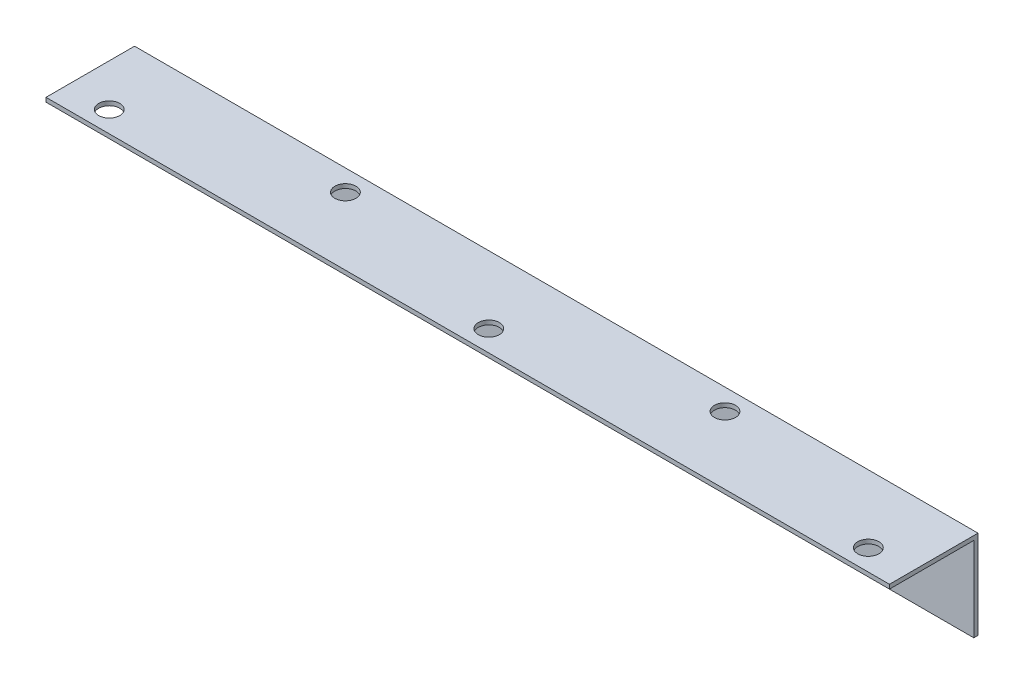
ISO-10303-21;
HEADER;
FILE_DESCRIPTION(('STEP AP214'),'2;1');
FILE_NAME('part.step','',(''),(''),'','','');
FILE_SCHEMA(('AUTOMOTIVE_DESIGN { 1 0 10303 214 1 1 1 1 }'));
ENDSEC;
DATA;
#1=APPLICATION_CONTEXT('core data for automotive mechanical design processes');
#2=APPLICATION_PROTOCOL_DEFINITION('international standard','automotive_design',2000,#1);
#3=PRODUCT_CONTEXT('',#1,'mechanical');
#4=PRODUCT('Part','Part','',(#3));
#5=PRODUCT_RELATED_PRODUCT_CATEGORY('part','',(#4));
#6=PRODUCT_DEFINITION_FORMATION('','',#4);
#7=PRODUCT_DEFINITION_CONTEXT('part definition',#1,'design');
#8=PRODUCT_DEFINITION('design','',#6,#7);
#9=PRODUCT_DEFINITION_SHAPE('','',#8);
#10=(LENGTH_UNIT() NAMED_UNIT(*) SI_UNIT(.MILLI.,.METRE.));
#11=(NAMED_UNIT(*) PLANE_ANGLE_UNIT() SI_UNIT($,.RADIAN.));
#12=(NAMED_UNIT(*) SI_UNIT($,.STERADIAN.) SOLID_ANGLE_UNIT());
#13=UNCERTAINTY_MEASURE_WITH_UNIT(LENGTH_MEASURE(1.E-05),#10,'distance_accuracy_value','');
#14=(GEOMETRIC_REPRESENTATION_CONTEXT(3) GLOBAL_UNCERTAINTY_ASSIGNED_CONTEXT((#13)) GLOBAL_UNIT_ASSIGNED_CONTEXT((#10,
#11,#12)) REPRESENTATION_CONTEXT('',''));
#15=CARTESIAN_POINT('',(0.,0.,0.));
#16=DIRECTION('',(0.,0.,1.));
#17=DIRECTION('',(1.,0.,0.));
#18=AXIS2_PLACEMENT_3D('',#15,#16,#17);
#19=CARTESIAN_POINT('',(0.,0.,1.));
#20=DIRECTION('',(-1.,0.,0.));
#21=DIRECTION('',(0.,0.,1.));
#22=AXIS2_PLACEMENT_3D('',#19,#20,#21);
#23=PLANE('',#22);
#24=DIRECTION('',(0.,1.,0.));
#25=VECTOR('',#24,1.);
#26=CARTESIAN_POINT('',(0.,0.,0.));
#27=LINE('',#26,#25);
#28=CARTESIAN_POINT('',(0.,0.,0.));
#29=VERTEX_POINT('',#28);
#30=CARTESIAN_POINT('',(0.,21.,0.));
#31=VERTEX_POINT('',#30);
#32=EDGE_CURVE('E116',#29,#31,#27,.T.);
#33=ORIENTED_EDGE('',*,*,#32,.T.);
#34=DIRECTION('',(0.,0.,-1.));
#35=VECTOR('',#34,1.);
#36=CARTESIAN_POINT('',(0.,21.,0.));
#37=LINE('',#36,#35);
#38=CARTESIAN_POINT('',(0.,21.,21.));
#39=VERTEX_POINT('',#38);
#40=EDGE_CURVE('E194',#39,#31,#37,.T.);
#41=ORIENTED_EDGE('',*,*,#40,.F.);
#42=DIRECTION('',(0.,-1.,0.));
#43=VECTOR('',#42,1.);
#44=CARTESIAN_POINT('',(0.,21.,21.));
#45=LINE('',#44,#43);
#46=CARTESIAN_POINT('',(0.,20.,21.));
#47=VERTEX_POINT('',#46);
#48=EDGE_CURVE('E201',#39,#47,#45,.T.);
#49=ORIENTED_EDGE('',*,*,#48,.T.);
#50=DIRECTION('',(0.,0.,-1.));
#51=VECTOR('',#50,1.);
#52=CARTESIAN_POINT('',(0.,20.,0.));
#53=LINE('',#52,#51);
#54=CARTESIAN_POINT('',(0.,20.,1.));
#55=VERTEX_POINT('',#54);
#56=EDGE_CURVE('E190',#47,#55,#53,.T.);
#57=ORIENTED_EDGE('',*,*,#56,.T.);
#58=DIRECTION('',(0.,1.,0.));
#59=VECTOR('',#58,1.);
#60=CARTESIAN_POINT('',(0.,0.,1.));
#61=LINE('',#60,#59);
#62=CARTESIAN_POINT('',(0.,0.,1.));
#63=VERTEX_POINT('',#62);
#64=EDGE_CURVE('E106',#63,#55,#61,.T.);
#65=ORIENTED_EDGE('',*,*,#64,.F.);
#66=DIRECTION('',(0.,0.,-1.));
#67=VECTOR('',#66,1.);
#68=CARTESIAN_POINT('',(0.,0.,1.));
#69=LINE('',#68,#67);
#70=EDGE_CURVE('E52',#63,#29,#69,.T.);
#71=ORIENTED_EDGE('',*,*,#70,.T.);
#72=EDGE_LOOP('',(#33,#41,#49,#57,#65,#71));
#73=FACE_BOUND('',#72,.T.);
#74=ADVANCED_FACE('F42',(#73),#23,.F.);
#75=CARTESIAN_POINT('',(-200.,0.,1.));
#76=DIRECTION('',(1.,0.,0.));
#77=DIRECTION('',(0.,0.,-1.));
#78=AXIS2_PLACEMENT_3D('',#75,#76,#77);
#79=PLANE('',#78);
#80=DIRECTION('',(0.,-1.,0.));
#81=VECTOR('',#80,1.);
#82=CARTESIAN_POINT('',(-200.,0.,0.));
#83=LINE('',#82,#81);
#84=CARTESIAN_POINT('',(-200.,21.,0.));
#85=VERTEX_POINT('',#84);
#86=CARTESIAN_POINT('',(-200.,0.,0.));
#87=VERTEX_POINT('',#86);
#88=EDGE_CURVE('E73',#85,#87,#83,.T.);
#89=ORIENTED_EDGE('',*,*,#88,.T.);
#90=DIRECTION('',(0.,0.,-1.));
#91=VECTOR('',#90,1.);
#92=CARTESIAN_POINT('',(-200.,0.,1.));
#93=LINE('',#92,#91);
#94=CARTESIAN_POINT('',(-200.,0.,1.));
#95=VERTEX_POINT('',#94);
#96=EDGE_CURVE('E11',#95,#87,#93,.T.);
#97=ORIENTED_EDGE('',*,*,#96,.F.);
#98=DIRECTION('',(0.,-1.,0.));
#99=VECTOR('',#98,1.);
#100=CARTESIAN_POINT('',(-200.,0.,1.));
#101=LINE('',#100,#99);
#102=CARTESIAN_POINT('',(-200.,20.,1.));
#103=VERTEX_POINT('',#102);
#104=EDGE_CURVE('E104',#103,#95,#101,.T.);
#105=ORIENTED_EDGE('',*,*,#104,.F.);
#106=DIRECTION('',(0.,0.,1.));
#107=VECTOR('',#106,1.);
#108=CARTESIAN_POINT('',(-200.,20.,0.));
#109=LINE('',#108,#107);
#110=CARTESIAN_POINT('',(-200.,20.,21.));
#111=VERTEX_POINT('',#110);
#112=EDGE_CURVE('E91',#103,#111,#109,.T.);
#113=ORIENTED_EDGE('',*,*,#112,.T.);
#114=DIRECTION('',(0.,-1.,0.));
#115=VECTOR('',#114,1.);
#116=CARTESIAN_POINT('',(-200.,21.,21.));
#117=LINE('',#116,#115);
#118=CARTESIAN_POINT('',(-200.,21.,21.));
#119=VERTEX_POINT('',#118);
#120=EDGE_CURVE('E120',#119,#111,#117,.T.);
#121=ORIENTED_EDGE('',*,*,#120,.F.);
#122=DIRECTION('',(0.,0.,1.));
#123=VECTOR('',#122,1.);
#124=CARTESIAN_POINT('',(-200.,21.,0.));
#125=LINE('',#124,#123);
#126=EDGE_CURVE('E185',#85,#119,#125,.T.);
#127=ORIENTED_EDGE('',*,*,#126,.F.);
#128=EDGE_LOOP('',(#89,#97,#105,#113,#121,#127));
#129=FACE_BOUND('',#128,.T.);
#130=ADVANCED_FACE('F109',(#129),#79,.F.);
#131=CARTESIAN_POINT('',(0.,0.,1.));
#132=DIRECTION('',(0.,1.,0.));
#133=DIRECTION('',(0.,0.,1.));
#134=AXIS2_PLACEMENT_3D('',#131,#132,#133);
#135=PLANE('',#134);
#136=DIRECTION('',(1.,0.,0.));
#137=VECTOR('',#136,1.);
#138=CARTESIAN_POINT('',(0.,0.,0.));
#139=LINE('',#138,#137);
#140=EDGE_CURVE('E123',#87,#29,#139,.T.);
#141=ORIENTED_EDGE('',*,*,#140,.T.);
#142=ORIENTED_EDGE('',*,*,#70,.F.);
#143=DIRECTION('',(1.,0.,0.));
#144=VECTOR('',#143,1.);
#145=CARTESIAN_POINT('',(0.,0.,1.));
#146=LINE('',#145,#144);
#147=EDGE_CURVE('E61',#95,#63,#146,.T.);
#148=ORIENTED_EDGE('',*,*,#147,.F.);
#149=ORIENTED_EDGE('',*,*,#96,.T.);
#150=EDGE_LOOP('',(#141,#142,#148,#149));
#151=FACE_BOUND('',#150,.T.);
#152=ADVANCED_FACE('F232',(#151),#135,.F.);
#153=CARTESIAN_POINT('',(0.,0.,1.));
#154=DIRECTION('',(0.,0.,1.));
#155=DIRECTION('',(1.,0.,0.));
#156=AXIS2_PLACEMENT_3D('',#153,#154,#155);
#157=PLANE('',#156);
#158=CARTESIAN_POINT('',(-140.,9.37245522552197,1.));
#159=DIRECTION('',(0.,0.,1.));
#160=DIRECTION('',(1.,0.,0.));
#161=AXIS2_PLACEMENT_3D('',#158,#159,#160);
#162=CIRCLE('',#161,3.99999999999999);
#163=CARTESIAN_POINT('',(-136.,9.37245522552197,1.));
#164=VERTEX_POINT('',#163);
#165=EDGE_CURVE('E131',#164,#164,#162,.T.);
#166=ORIENTED_EDGE('',*,*,#165,.F.);
#167=EDGE_LOOP('',(#166));
#168=FACE_BOUND('',#167,.T.);
#169=CARTESIAN_POINT('',(-60.,9.37245522552199,1.));
#170=DIRECTION('',(0.,0.,1.));
#171=DIRECTION('',(1.,0.,0.));
#172=AXIS2_PLACEMENT_3D('',#169,#170,#171);
#173=CIRCLE('',#172,4.00000000000001);
#174=CARTESIAN_POINT('',(-56.,9.37245522552199,1.));
#175=VERTEX_POINT('',#174);
#176=EDGE_CURVE('E139',#175,#175,#173,.T.);
#177=ORIENTED_EDGE('',*,*,#176,.F.);
#178=EDGE_LOOP('',(#177));
#179=FACE_BOUND('',#178,.T.);
#180=ORIENTED_EDGE('',*,*,#64,.T.);
#181=DIRECTION('',(-1.,0.,0.));
#182=VECTOR('',#181,1.);
#183=CARTESIAN_POINT('',(0.,20.,1.));
#184=LINE('',#183,#182);
#185=EDGE_CURVE('E82',#55,#103,#184,.T.);
#186=ORIENTED_EDGE('',*,*,#185,.T.);
#187=ORIENTED_EDGE('',*,*,#104,.T.);
#188=ORIENTED_EDGE('',*,*,#147,.T.);
#189=EDGE_LOOP('',(#180,#186,#187,#188));
#190=FACE_BOUND('',#189,.T.);
#191=ADVANCED_FACE('F103',(#168,#179,#190),#157,.T.);
#192=CARTESIAN_POINT('',(0.,0.,0.));
#193=DIRECTION('',(0.,0.,1.));
#194=DIRECTION('',(1.,0.,0.));
#195=AXIS2_PLACEMENT_3D('',#192,#193,#194);
#196=PLANE('',#195);
#197=CARTESIAN_POINT('',(-140.,9.37245522552197,0.));
#198=DIRECTION('',(0.,0.,1.));
#199=DIRECTION('',(1.,0.,0.));
#200=AXIS2_PLACEMENT_3D('',#197,#198,#199);
#201=CIRCLE('',#200,3.99999999999999);
#202=CARTESIAN_POINT('',(-136.,9.37245522552197,0.));
#203=VERTEX_POINT('',#202);
#204=EDGE_CURVE('E45',#203,#203,#201,.T.);
#205=ORIENTED_EDGE('',*,*,#204,.T.);
#206=EDGE_LOOP('',(#205));
#207=FACE_BOUND('',#206,.T.);
#208=CARTESIAN_POINT('',(-60.,9.37245522552199,0.));
#209=DIRECTION('',(0.,0.,1.));
#210=DIRECTION('',(1.,0.,0.));
#211=AXIS2_PLACEMENT_3D('',#208,#209,#210);
#212=CIRCLE('',#211,4.00000000000001);
#213=CARTESIAN_POINT('',(-56.,9.37245522552199,0.));
#214=VERTEX_POINT('',#213);
#215=EDGE_CURVE('E128',#214,#214,#212,.T.);
#216=ORIENTED_EDGE('',*,*,#215,.T.);
#217=EDGE_LOOP('',(#216));
#218=FACE_BOUND('',#217,.T.);
#219=ORIENTED_EDGE('',*,*,#32,.F.);
#220=ORIENTED_EDGE('',*,*,#140,.F.);
#221=ORIENTED_EDGE('',*,*,#88,.F.);
#222=DIRECTION('',(-1.,0.,0.));
#223=VECTOR('',#222,1.);
#224=CARTESIAN_POINT('',(-200.,21.,0.));
#225=LINE('',#224,#223);
#226=EDGE_CURVE('E198',#31,#85,#225,.T.);
#227=ORIENTED_EDGE('',*,*,#226,.F.);
#228=EDGE_LOOP('',(#219,#220,#221,#227));
#229=FACE_BOUND('',#228,.T.);
#230=ADVANCED_FACE('F230',(#207,#218,#229),#196,.F.);
#231=CARTESIAN_POINT('',(0.,21.,0.));
#232=DIRECTION('',(0.,1.,0.));
#233=DIRECTION('',(0.,0.,1.));
#234=AXIS2_PLACEMENT_3D('',#231,#232,#233);
#235=PLANE('',#234);
#236=CARTESIAN_POINT('',(-55.,21.,5.));
#237=DIRECTION('',(0.,1.,0.));
#238=DIRECTION('',(0.,0.,1.));
#239=AXIS2_PLACEMENT_3D('',#236,#237,#238);
#240=CIRCLE('',#239,2.5);
#241=CARTESIAN_POINT('',(-55.,21.,7.5));
#242=VERTEX_POINT('',#241);
#243=EDGE_CURVE('E155',#242,#242,#240,.T.);
#244=ORIENTED_EDGE('',*,*,#243,.F.);
#245=EDGE_LOOP('',(#244));
#246=FACE_BOUND('',#245,.T.);
#247=CARTESIAN_POINT('',(-145.,21.,5.));
#248=DIRECTION('',(0.,1.,0.));
#249=DIRECTION('',(0.,0.,1.));
#250=AXIS2_PLACEMENT_3D('',#247,#248,#249);
#251=CIRCLE('',#250,2.5);
#252=CARTESIAN_POINT('',(-145.,21.,7.5));
#253=VERTEX_POINT('',#252);
#254=EDGE_CURVE('E171',#253,#253,#251,.T.);
#255=ORIENTED_EDGE('',*,*,#254,.F.);
#256=EDGE_LOOP('',(#255));
#257=FACE_BOUND('',#256,.T.);
#258=ORIENTED_EDGE('',*,*,#126,.T.);
#259=DIRECTION('',(1.,0.,0.));
#260=VECTOR('',#259,1.);
#261=CARTESIAN_POINT('',(-200.,21.,21.));
#262=LINE('',#261,#260);
#263=EDGE_CURVE('E189',#119,#39,#262,.T.);
#264=ORIENTED_EDGE('',*,*,#263,.T.);
#265=ORIENTED_EDGE('',*,*,#40,.T.);
#266=ORIENTED_EDGE('',*,*,#226,.T.);
#267=EDGE_LOOP('',(#258,#264,#265,#266));
#268=FACE_BOUND('',#267,.T.);
#269=CARTESIAN_POINT('',(-190.,21.,16.));
#270=DIRECTION('',(0.,1.,0.));
#271=DIRECTION('',(0.,0.,1.));
#272=AXIS2_PLACEMENT_3D('',#269,#270,#271);
#273=CIRCLE('',#272,2.5);
#274=CARTESIAN_POINT('',(-190.,21.,18.5));
#275=VERTEX_POINT('',#274);
#276=EDGE_CURVE('E101',#275,#275,#273,.T.);
#277=ORIENTED_EDGE('',*,*,#276,.F.);
#278=EDGE_LOOP('',(#277));
#279=FACE_BOUND('',#278,.T.);
#280=CARTESIAN_POINT('',(-100.,21.,16.));
#281=DIRECTION('',(0.,1.,0.));
#282=DIRECTION('',(0.,0.,1.));
#283=AXIS2_PLACEMENT_3D('',#280,#281,#282);
#284=CIRCLE('',#283,2.49999999999999);
#285=CARTESIAN_POINT('',(-100.,21.,18.5));
#286=VERTEX_POINT('',#285);
#287=EDGE_CURVE('E163',#286,#286,#284,.T.);
#288=ORIENTED_EDGE('',*,*,#287,.F.);
#289=EDGE_LOOP('',(#288));
#290=FACE_BOUND('',#289,.T.);
#291=CARTESIAN_POINT('',(-10.,21.,16.));
#292=DIRECTION('',(0.,1.,0.));
#293=DIRECTION('',(0.,0.,1.));
#294=AXIS2_PLACEMENT_3D('',#291,#292,#293);
#295=CIRCLE('',#294,2.5);
#296=CARTESIAN_POINT('',(-10.,21.,18.5));
#297=VERTEX_POINT('',#296);
#298=EDGE_CURVE('E147',#297,#297,#295,.T.);
#299=ORIENTED_EDGE('',*,*,#298,.F.);
#300=EDGE_LOOP('',(#299));
#301=FACE_BOUND('',#300,.T.);
#302=ADVANCED_FACE('F228',(#246,#257,#268,#279,#290,#301),#235,.T.);
#303=CARTESIAN_POINT('',(0.,20.,0.));
#304=DIRECTION('',(0.,1.,0.));
#305=DIRECTION('',(0.,0.,1.));
#306=AXIS2_PLACEMENT_3D('',#303,#304,#305);
#307=PLANE('',#306);
#308=ORIENTED_EDGE('',*,*,#185,.F.);
#309=ORIENTED_EDGE('',*,*,#56,.F.);
#310=DIRECTION('',(1.,0.,0.));
#311=VECTOR('',#310,1.);
#312=CARTESIAN_POINT('',(-200.,20.,21.));
#313=LINE('',#312,#311);
#314=EDGE_CURVE('E96',#111,#47,#313,.T.);
#315=ORIENTED_EDGE('',*,*,#314,.F.);
#316=ORIENTED_EDGE('',*,*,#112,.F.);
#317=EDGE_LOOP('',(#308,#309,#315,#316));
#318=FACE_BOUND('',#317,.T.);
#319=CARTESIAN_POINT('',(-190.,20.,16.));
#320=DIRECTION('',(0.,1.,0.));
#321=DIRECTION('',(0.,0.,1.));
#322=AXIS2_PLACEMENT_3D('',#319,#320,#321);
#323=CIRCLE('',#322,2.5);
#324=CARTESIAN_POINT('',(-190.,20.,18.5));
#325=VERTEX_POINT('',#324);
#326=EDGE_CURVE('E175',#325,#325,#323,.T.);
#327=ORIENTED_EDGE('',*,*,#326,.T.);
#328=EDGE_LOOP('',(#327));
#329=FACE_BOUND('',#328,.T.);
#330=CARTESIAN_POINT('',(-145.,20.,5.));
#331=DIRECTION('',(0.,1.,0.));
#332=DIRECTION('',(0.,0.,1.));
#333=AXIS2_PLACEMENT_3D('',#330,#331,#332);
#334=CIRCLE('',#333,2.5);
#335=CARTESIAN_POINT('',(-145.,20.,7.5));
#336=VERTEX_POINT('',#335);
#337=EDGE_CURVE('E167',#336,#336,#334,.T.);
#338=ORIENTED_EDGE('',*,*,#337,.T.);
#339=EDGE_LOOP('',(#338));
#340=FACE_BOUND('',#339,.T.);
#341=CARTESIAN_POINT('',(-100.,20.,16.));
#342=DIRECTION('',(0.,1.,0.));
#343=DIRECTION('',(0.,0.,1.));
#344=AXIS2_PLACEMENT_3D('',#341,#342,#343);
#345=CIRCLE('',#344,2.49999999999999);
#346=CARTESIAN_POINT('',(-100.,20.,18.5));
#347=VERTEX_POINT('',#346);
#348=EDGE_CURVE('E159',#347,#347,#345,.T.);
#349=ORIENTED_EDGE('',*,*,#348,.T.);
#350=EDGE_LOOP('',(#349));
#351=FACE_BOUND('',#350,.T.);
#352=CARTESIAN_POINT('',(-55.,20.,5.));
#353=DIRECTION('',(0.,1.,0.));
#354=DIRECTION('',(0.,0.,1.));
#355=AXIS2_PLACEMENT_3D('',#352,#353,#354);
#356=CIRCLE('',#355,2.5);
#357=CARTESIAN_POINT('',(-55.,20.,7.5));
#358=VERTEX_POINT('',#357);
#359=EDGE_CURVE('E151',#358,#358,#356,.T.);
#360=ORIENTED_EDGE('',*,*,#359,.T.);
#361=EDGE_LOOP('',(#360));
#362=FACE_BOUND('',#361,.T.);
#363=CARTESIAN_POINT('',(-10.,20.,16.));
#364=DIRECTION('',(0.,1.,0.));
#365=DIRECTION('',(0.,0.,1.));
#366=AXIS2_PLACEMENT_3D('',#363,#364,#365);
#367=CIRCLE('',#366,2.5);
#368=CARTESIAN_POINT('',(-10.,20.,18.5));
#369=VERTEX_POINT('',#368);
#370=EDGE_CURVE('E137',#369,#369,#367,.T.);
#371=ORIENTED_EDGE('',*,*,#370,.T.);
#372=EDGE_LOOP('',(#371));
#373=FACE_BOUND('',#372,.T.);
#374=ADVANCED_FACE('F92',(#318,#329,#340,#351,#362,#373),#307,.F.);
#375=CARTESIAN_POINT('',(-200.,21.,21.));
#376=DIRECTION('',(0.,0.,-1.));
#377=DIRECTION('',(-1.,0.,0.));
#378=AXIS2_PLACEMENT_3D('',#375,#376,#377);
#379=PLANE('',#378);
#380=ORIENTED_EDGE('',*,*,#314,.T.);
#381=ORIENTED_EDGE('',*,*,#48,.F.);
#382=ORIENTED_EDGE('',*,*,#263,.F.);
#383=ORIENTED_EDGE('',*,*,#120,.T.);
#384=EDGE_LOOP('',(#380,#381,#382,#383));
#385=FACE_BOUND('',#384,.T.);
#386=ADVANCED_FACE('F214',(#385),#379,.F.);
#387=CARTESIAN_POINT('',(-190.,21.,16.));
#388=DIRECTION('',(0.,-1.,0.));
#389=DIRECTION('',(0.,0.,-1.));
#390=AXIS2_PLACEMENT_3D('',#387,#388,#389);
#391=CYLINDRICAL_SURFACE('',#390,2.5);
#392=ORIENTED_EDGE('',*,*,#276,.T.);
#393=EDGE_LOOP('',(#392));
#394=FACE_BOUND('',#393,.T.);
#395=ORIENTED_EDGE('',*,*,#326,.F.);
#396=EDGE_LOOP('',(#395));
#397=FACE_BOUND('',#396,.T.);
#398=ADVANCED_FACE('F281',(#394,#397),#391,.F.);
#399=CARTESIAN_POINT('',(-145.,21.,5.));
#400=DIRECTION('',(0.,-1.,0.));
#401=DIRECTION('',(0.,0.,-1.));
#402=AXIS2_PLACEMENT_3D('',#399,#400,#401);
#403=CYLINDRICAL_SURFACE('',#402,2.5);
#404=ORIENTED_EDGE('',*,*,#254,.T.);
#405=EDGE_LOOP('',(#404));
#406=FACE_BOUND('',#405,.T.);
#407=ORIENTED_EDGE('',*,*,#337,.F.);
#408=EDGE_LOOP('',(#407));
#409=FACE_BOUND('',#408,.T.);
#410=ADVANCED_FACE('F291',(#406,#409),#403,.F.);
#411=CARTESIAN_POINT('',(-100.,21.,16.));
#412=DIRECTION('',(0.,-1.,0.));
#413=DIRECTION('',(0.,0.,-1.));
#414=AXIS2_PLACEMENT_3D('',#411,#412,#413);
#415=CYLINDRICAL_SURFACE('',#414,2.49999999999999);
#416=ORIENTED_EDGE('',*,*,#287,.T.);
#417=EDGE_LOOP('',(#416));
#418=FACE_BOUND('',#417,.T.);
#419=ORIENTED_EDGE('',*,*,#348,.F.);
#420=EDGE_LOOP('',(#419));
#421=FACE_BOUND('',#420,.T.);
#422=ADVANCED_FACE('F302',(#418,#421),#415,.F.);
#423=CARTESIAN_POINT('',(-55.,21.,5.));
#424=DIRECTION('',(0.,-1.,0.));
#425=DIRECTION('',(0.,0.,-1.));
#426=AXIS2_PLACEMENT_3D('',#423,#424,#425);
#427=CYLINDRICAL_SURFACE('',#426,2.5);
#428=ORIENTED_EDGE('',*,*,#243,.T.);
#429=EDGE_LOOP('',(#428));
#430=FACE_BOUND('',#429,.T.);
#431=ORIENTED_EDGE('',*,*,#359,.F.);
#432=EDGE_LOOP('',(#431));
#433=FACE_BOUND('',#432,.T.);
#434=ADVANCED_FACE('F313',(#430,#433),#427,.F.);
#435=CARTESIAN_POINT('',(-10.,21.,16.));
#436=DIRECTION('',(0.,-1.,0.));
#437=DIRECTION('',(0.,0.,-1.));
#438=AXIS2_PLACEMENT_3D('',#435,#436,#437);
#439=CYLINDRICAL_SURFACE('',#438,2.5);
#440=ORIENTED_EDGE('',*,*,#298,.T.);
#441=EDGE_LOOP('',(#440));
#442=FACE_BOUND('',#441,.T.);
#443=ORIENTED_EDGE('',*,*,#370,.F.);
#444=EDGE_LOOP('',(#443));
#445=FACE_BOUND('',#444,.T.);
#446=ADVANCED_FACE('F324',(#442,#445),#439,.F.);
#447=CARTESIAN_POINT('',(-60.,9.37245522552199,-9.));
#448=DIRECTION('',(0.,0.,1.));
#449=DIRECTION('',(1.,0.,0.));
#450=AXIS2_PLACEMENT_3D('',#447,#448,#449);
#451=CYLINDRICAL_SURFACE('',#450,4.00000000000001);
#452=ORIENTED_EDGE('',*,*,#176,.T.);
#453=EDGE_LOOP('',(#452));
#454=FACE_BOUND('',#453,.T.);
#455=ORIENTED_EDGE('',*,*,#215,.F.);
#456=EDGE_LOOP('',(#455));
#457=FACE_BOUND('',#456,.T.);
#458=ADVANCED_FACE('F334',(#454,#457),#451,.F.);
#459=CARTESIAN_POINT('',(-140.,9.37245522552197,-9.));
#460=DIRECTION('',(0.,0.,1.));
#461=DIRECTION('',(1.,0.,0.));
#462=AXIS2_PLACEMENT_3D('',#459,#460,#461);
#463=CYLINDRICAL_SURFACE('',#462,3.99999999999999);
#464=ORIENTED_EDGE('',*,*,#165,.T.);
#465=EDGE_LOOP('',(#464));
#466=FACE_BOUND('',#465,.T.);
#467=ORIENTED_EDGE('',*,*,#204,.F.);
#468=EDGE_LOOP('',(#467));
#469=FACE_BOUND('',#468,.T.);
#470=ADVANCED_FACE('F353',(#466,#469),#463,.F.);
#471=CLOSED_SHELL('',(#74,#130,#152,#191,#230,#302,#374,#386,#398,#410,#422,#434,#446,#458,#470));
#472=MANIFOLD_SOLID_BREP('B2',#471);
#473=ADVANCED_BREP_SHAPE_REPRESENTATION('',(#18,#472),#14);
#474=SHAPE_DEFINITION_REPRESENTATION(#9,#473);
ENDSEC;
END-ISO-10303-21;
